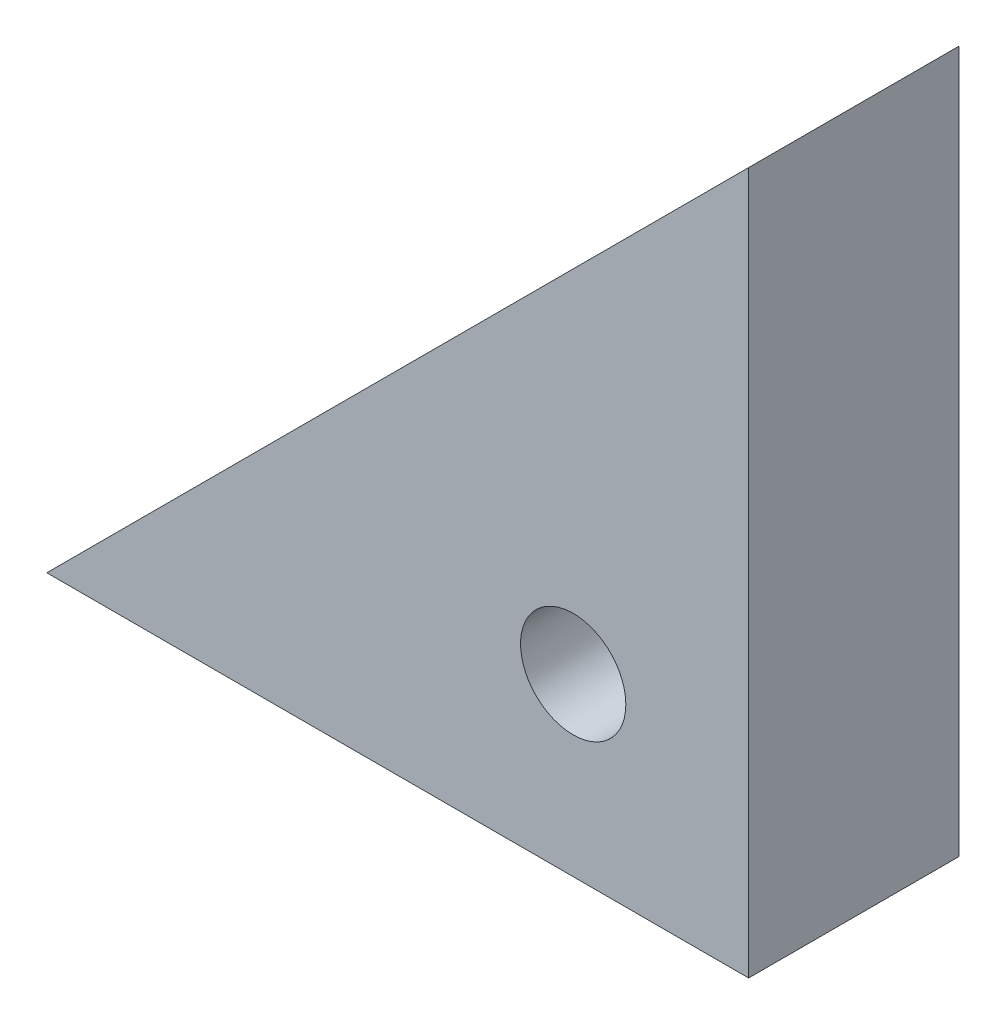
ISO-10303-21;
HEADER;
FILE_DESCRIPTION(('STEP AP214'),'2;1');
FILE_NAME('part.step','',(''),(''),'','','');
FILE_SCHEMA(('AUTOMOTIVE_DESIGN { 1 0 10303 214 1 1 1 1 }'));
ENDSEC;
DATA;
#1=APPLICATION_CONTEXT('core data for automotive mechanical design processes');
#2=APPLICATION_PROTOCOL_DEFINITION('international standard','automotive_design',2000,#1);
#3=PRODUCT_CONTEXT('',#1,'mechanical');
#4=PRODUCT('Part','Part','',(#3));
#5=PRODUCT_RELATED_PRODUCT_CATEGORY('part','',(#4));
#6=PRODUCT_DEFINITION_FORMATION('','',#4);
#7=PRODUCT_DEFINITION_CONTEXT('part definition',#1,'design');
#8=PRODUCT_DEFINITION('design','',#6,#7);
#9=PRODUCT_DEFINITION_SHAPE('','',#8);
#10=(LENGTH_UNIT() NAMED_UNIT(*) SI_UNIT(.MILLI.,.METRE.));
#11=(NAMED_UNIT(*) PLANE_ANGLE_UNIT() SI_UNIT($,.RADIAN.));
#12=(NAMED_UNIT(*) SI_UNIT($,.STERADIAN.) SOLID_ANGLE_UNIT());
#13=UNCERTAINTY_MEASURE_WITH_UNIT(LENGTH_MEASURE(1.E-05),#10,'distance_accuracy_value','');
#14=(GEOMETRIC_REPRESENTATION_CONTEXT(3) GLOBAL_UNCERTAINTY_ASSIGNED_CONTEXT((#13)) GLOBAL_UNIT_ASSIGNED_CONTEXT((#10,
#11,#12)) REPRESENTATION_CONTEXT('',''));
#15=CARTESIAN_POINT('',(0.,0.,0.));
#16=DIRECTION('',(0.,0.,1.));
#17=DIRECTION('',(1.,0.,0.));
#18=AXIS2_PLACEMENT_3D('',#15,#16,#17);
#19=CARTESIAN_POINT('',(0.,0.,6.));
#20=DIRECTION('',(0.,0.,1.));
#21=DIRECTION('',(1.,0.,0.));
#22=AXIS2_PLACEMENT_3D('',#19,#20,#21);
#23=PLANE('',#22);
#24=DIRECTION('',(-0.707106781186548,-0.707106781186548,0.));
#25=VECTOR('',#24,1.);
#26=CARTESIAN_POINT('',(10.,20.,6.));
#27=LINE('',#26,#25);
#28=CARTESIAN_POINT('',(10.,20.,6.));
#29=VERTEX_POINT('',#28);
#30=CARTESIAN_POINT('',(-10.,0.,6.));
#31=VERTEX_POINT('',#30);
#32=EDGE_CURVE('E76',#29,#31,#27,.T.);
#33=ORIENTED_EDGE('',*,*,#32,.T.);
#34=DIRECTION('',(1.,0.,0.));
#35=VECTOR('',#34,1.);
#36=CARTESIAN_POINT('',(-10.,0.,6.));
#37=LINE('',#36,#35);
#38=CARTESIAN_POINT('',(10.,0.,6.));
#39=VERTEX_POINT('',#38);
#40=EDGE_CURVE('E72',#31,#39,#37,.T.);
#41=ORIENTED_EDGE('',*,*,#40,.T.);
#42=DIRECTION('',(0.,1.,0.));
#43=VECTOR('',#42,1.);
#44=CARTESIAN_POINT('',(10.,0.,6.));
#45=LINE('',#44,#43);
#46=EDGE_CURVE('E52',#39,#29,#45,.T.);
#47=ORIENTED_EDGE('',*,*,#46,.T.);
#48=EDGE_LOOP('',(#33,#41,#47));
#49=FACE_BOUND('',#48,.T.);
#50=CARTESIAN_POINT('',(5.,5.,6.));
#51=DIRECTION('',(0.,0.,1.));
#52=DIRECTION('',(1.,0.,0.));
#53=AXIS2_PLACEMENT_3D('',#50,#51,#52);
#54=CIRCLE('',#53,1.5);
#55=CARTESIAN_POINT('',(6.5,5.,6.));
#56=VERTEX_POINT('',#55);
#57=EDGE_CURVE('E86',#56,#56,#54,.T.);
#58=ORIENTED_EDGE('',*,*,#57,.F.);
#59=EDGE_LOOP('',(#58));
#60=FACE_BOUND('',#59,.T.);
#61=ADVANCED_FACE('F35',(#49,#60),#23,.T.);
#62=CARTESIAN_POINT('',(0.,0.,0.));
#63=DIRECTION('',(0.,0.,1.));
#64=DIRECTION('',(1.,0.,0.));
#65=AXIS2_PLACEMENT_3D('',#62,#63,#64);
#66=PLANE('',#65);
#67=DIRECTION('',(-0.707106781186548,-0.707106781186548,0.));
#68=VECTOR('',#67,1.);
#69=CARTESIAN_POINT('',(10.,20.,0.));
#70=LINE('',#69,#68);
#71=CARTESIAN_POINT('',(10.,20.,0.));
#72=VERTEX_POINT('',#71);
#73=CARTESIAN_POINT('',(-10.,0.,0.));
#74=VERTEX_POINT('',#73);
#75=EDGE_CURVE('E83',#72,#74,#70,.T.);
#76=ORIENTED_EDGE('',*,*,#75,.F.);
#77=DIRECTION('',(0.,1.,0.));
#78=VECTOR('',#77,1.);
#79=CARTESIAN_POINT('',(10.,0.,0.));
#80=LINE('',#79,#78);
#81=CARTESIAN_POINT('',(10.,0.,0.));
#82=VERTEX_POINT('',#81);
#83=EDGE_CURVE('E69',#82,#72,#80,.T.);
#84=ORIENTED_EDGE('',*,*,#83,.F.);
#85=DIRECTION('',(1.,0.,0.));
#86=VECTOR('',#85,1.);
#87=CARTESIAN_POINT('',(-10.,0.,0.));
#88=LINE('',#87,#86);
#89=EDGE_CURVE('E64',#74,#82,#88,.T.);
#90=ORIENTED_EDGE('',*,*,#89,.F.);
#91=EDGE_LOOP('',(#76,#84,#90));
#92=FACE_BOUND('',#91,.T.);
#93=CARTESIAN_POINT('',(5.,5.,0.));
#94=DIRECTION('',(0.,0.,1.));
#95=DIRECTION('',(1.,0.,0.));
#96=AXIS2_PLACEMENT_3D('',#93,#94,#95);
#97=CIRCLE('',#96,1.5);
#98=CARTESIAN_POINT('',(6.5,5.,0.));
#99=VERTEX_POINT('',#98);
#100=EDGE_CURVE('E90',#99,#99,#97,.T.);
#101=ORIENTED_EDGE('',*,*,#100,.T.);
#102=EDGE_LOOP('',(#101));
#103=FACE_BOUND('',#102,.T.);
#104=ADVANCED_FACE('F96',(#92,#103),#66,.F.);
#105=CARTESIAN_POINT('',(10.,20.,6.));
#106=DIRECTION('',(0.707106781186547,-0.707106781186547,0.));
#107=DIRECTION('',(0.707106781186548,0.707106781186548,0.));
#108=AXIS2_PLACEMENT_3D('',#105,#106,#107);
#109=PLANE('',#108);
#110=ORIENTED_EDGE('',*,*,#75,.T.);
#111=DIRECTION('',(0.,0.,-1.));
#112=VECTOR('',#111,1.);
#113=CARTESIAN_POINT('',(-10.,0.,6.));
#114=LINE('',#113,#112);
#115=EDGE_CURVE('E11',#31,#74,#114,.T.);
#116=ORIENTED_EDGE('',*,*,#115,.F.);
#117=ORIENTED_EDGE('',*,*,#32,.F.);
#118=DIRECTION('',(0.,0.,-1.));
#119=VECTOR('',#118,1.);
#120=CARTESIAN_POINT('',(10.,20.,6.));
#121=LINE('',#120,#119);
#122=EDGE_CURVE('E84',#29,#72,#121,.T.);
#123=ORIENTED_EDGE('',*,*,#122,.T.);
#124=EDGE_LOOP('',(#110,#116,#117,#123));
#125=FACE_BOUND('',#124,.T.);
#126=ADVANCED_FACE('F37',(#125),#109,.F.);
#127=CARTESIAN_POINT('',(-10.,0.,6.));
#128=DIRECTION('',(0.,1.,0.));
#129=DIRECTION('',(0.,0.,1.));
#130=AXIS2_PLACEMENT_3D('',#127,#128,#129);
#131=PLANE('',#130);
#132=ORIENTED_EDGE('',*,*,#89,.T.);
#133=DIRECTION('',(0.,0.,-1.));
#134=VECTOR('',#133,1.);
#135=CARTESIAN_POINT('',(10.,0.,6.));
#136=LINE('',#135,#134);
#137=EDGE_CURVE('E44',#39,#82,#136,.T.);
#138=ORIENTED_EDGE('',*,*,#137,.F.);
#139=ORIENTED_EDGE('',*,*,#40,.F.);
#140=ORIENTED_EDGE('',*,*,#115,.T.);
#141=EDGE_LOOP('',(#132,#138,#139,#140));
#142=FACE_BOUND('',#141,.T.);
#143=ADVANCED_FACE('F73',(#142),#131,.F.);
#144=CARTESIAN_POINT('',(10.,0.,6.));
#145=DIRECTION('',(-1.,0.,0.));
#146=DIRECTION('',(0.,-1.,0.));
#147=AXIS2_PLACEMENT_3D('',#144,#145,#146);
#148=PLANE('',#147);
#149=ORIENTED_EDGE('',*,*,#83,.T.);
#150=ORIENTED_EDGE('',*,*,#122,.F.);
#151=ORIENTED_EDGE('',*,*,#46,.F.);
#152=ORIENTED_EDGE('',*,*,#137,.T.);
#153=EDGE_LOOP('',(#149,#150,#151,#152));
#154=FACE_BOUND('',#153,.T.);
#155=ADVANCED_FACE('F95',(#154),#148,.F.);
#156=CARTESIAN_POINT('',(5.,5.,6.));
#157=DIRECTION('',(0.,0.,-1.));
#158=DIRECTION('',(-1.,0.,0.));
#159=AXIS2_PLACEMENT_3D('',#156,#157,#158);
#160=CYLINDRICAL_SURFACE('',#159,1.5);
#161=ORIENTED_EDGE('',*,*,#57,.T.);
#162=EDGE_LOOP('',(#161));
#163=FACE_BOUND('',#162,.T.);
#164=ORIENTED_EDGE('',*,*,#100,.F.);
#165=EDGE_LOOP('',(#164));
#166=FACE_BOUND('',#165,.T.);
#167=ADVANCED_FACE('F104',(#163,#166),#160,.F.);
#168=CLOSED_SHELL('',(#61,#104,#126,#143,#155,#167));
#169=MANIFOLD_SOLID_BREP('B2',#168);
#170=ADVANCED_BREP_SHAPE_REPRESENTATION('',(#18,#169),#14);
#171=SHAPE_DEFINITION_REPRESENTATION(#9,#170);
ENDSEC;
END-ISO-10303-21;
